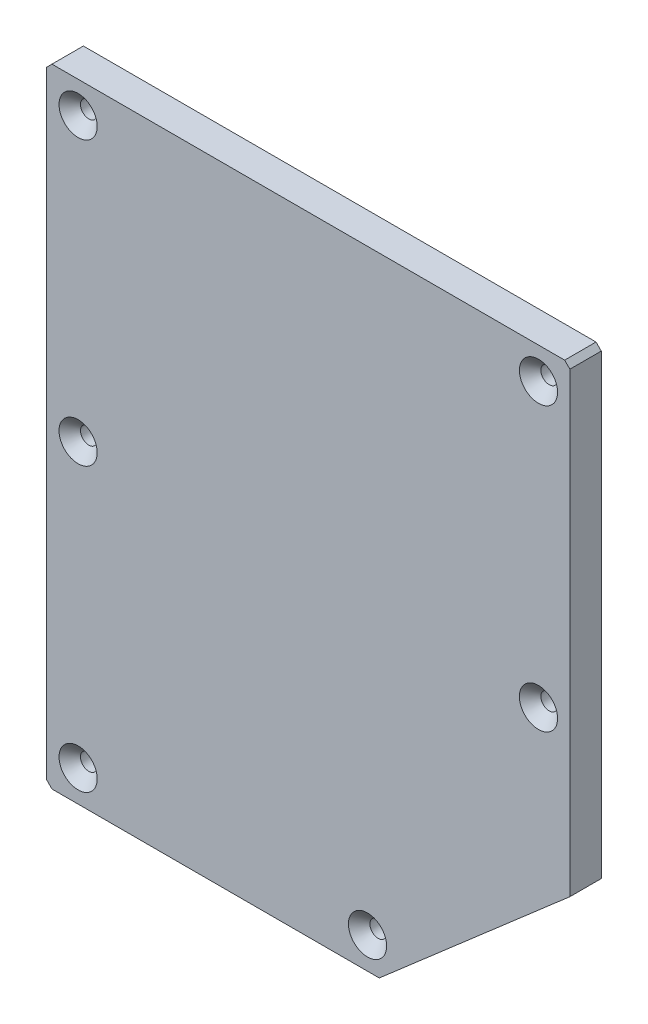
ISO-10303-21;
HEADER;
FILE_DESCRIPTION(('STEP AP214'),'2;1');
FILE_NAME('part.step','',(''),(''),'','','');
FILE_SCHEMA(('AUTOMOTIVE_DESIGN { 1 0 10303 214 1 1 1 1 }'));
ENDSEC;
DATA;
#1=APPLICATION_CONTEXT('core data for automotive mechanical design processes');
#2=APPLICATION_PROTOCOL_DEFINITION('international standard','automotive_design',2000,#1);
#3=PRODUCT_CONTEXT('',#1,'mechanical');
#4=PRODUCT('Part','Part','',(#3));
#5=PRODUCT_RELATED_PRODUCT_CATEGORY('part','',(#4));
#6=PRODUCT_DEFINITION_FORMATION('','',#4);
#7=PRODUCT_DEFINITION_CONTEXT('part definition',#1,'design');
#8=PRODUCT_DEFINITION('design','',#6,#7);
#9=PRODUCT_DEFINITION_SHAPE('','',#8);
#10=(LENGTH_UNIT() NAMED_UNIT(*) SI_UNIT(.MILLI.,.METRE.));
#11=(NAMED_UNIT(*) PLANE_ANGLE_UNIT() SI_UNIT($,.RADIAN.));
#12=(NAMED_UNIT(*) SI_UNIT($,.STERADIAN.) SOLID_ANGLE_UNIT());
#13=UNCERTAINTY_MEASURE_WITH_UNIT(LENGTH_MEASURE(1.E-05),#10,'distance_accuracy_value','');
#14=(GEOMETRIC_REPRESENTATION_CONTEXT(3) GLOBAL_UNCERTAINTY_ASSIGNED_CONTEXT((#13)) GLOBAL_UNIT_ASSIGNED_CONTEXT((#10,
#11,#12)) REPRESENTATION_CONTEXT('',''));
#15=CARTESIAN_POINT('',(0.,0.,0.));
#16=DIRECTION('',(0.,0.,1.));
#17=DIRECTION('',(1.,0.,0.));
#18=AXIS2_PLACEMENT_3D('',#15,#16,#17);
#19=CARTESIAN_POINT('',(23.5648315155221,-76.4003037206351,6.));
#20=DIRECTION('',(-0.656059028990506,0.754709580222773,0.));
#21=DIRECTION('',(-0.754709580222773,-0.656059028990506,0.));
#22=AXIS2_PLACEMENT_3D('',#19,#20,#21);
#23=PLANE('',#22);
#24=DIRECTION('',(0.754709580222773,0.656059028990506,0.));
#25=VECTOR('',#24,1.);
#26=CARTESIAN_POINT('',(23.5648315155221,-76.4003037206351,0.));
#27=LINE('',#26,#25);
#28=CARTESIAN_POINT('',(23.5648315155221,-76.4003037206351,0.));
#29=VERTEX_POINT('',#28);
#30=CARTESIAN_POINT('',(59.999999999999,-44.7276949669797,0.));
#31=VERTEX_POINT('',#30);
#32=EDGE_CURVE('E129',#29,#31,#27,.T.);
#33=ORIENTED_EDGE('',*,*,#32,.T.);
#34=DIRECTION('',(0.,0.,-1.));
#35=VECTOR('',#34,1.);
#36=CARTESIAN_POINT('',(59.999999999999,-44.7276949669797,6.));
#37=LINE('',#36,#35);
#38=CARTESIAN_POINT('',(59.999999999999,-44.7276949669797,6.));
#39=VERTEX_POINT('',#38);
#40=EDGE_CURVE('E11',#39,#31,#37,.T.);
#41=ORIENTED_EDGE('',*,*,#40,.F.);
#42=DIRECTION('',(0.754709580222773,0.656059028990506,0.));
#43=VECTOR('',#42,1.);
#44=CARTESIAN_POINT('',(23.5648315155221,-76.4003037206351,6.));
#45=LINE('',#44,#43);
#46=CARTESIAN_POINT('',(23.5648315155221,-76.4003037206351,6.));
#47=VERTEX_POINT('',#46);
#48=EDGE_CURVE('E144',#47,#39,#45,.T.);
#49=ORIENTED_EDGE('',*,*,#48,.F.);
#50=DIRECTION('',(0.,0.,-1.));
#51=VECTOR('',#50,1.);
#52=CARTESIAN_POINT('',(23.5648315155221,-76.4003037206351,6.));
#53=LINE('',#52,#51);
#54=EDGE_CURVE('E125',#47,#29,#53,.T.);
#55=ORIENTED_EDGE('',*,*,#54,.T.);
#56=EDGE_LOOP('',(#33,#41,#49,#55));
#57=FACE_BOUND('',#56,.T.);
#58=ADVANCED_FACE('F33',(#57),#23,.F.);
#59=CARTESIAN_POINT('',(59.999999999999,-44.7276949669797,6.));
#60=DIRECTION('',(-1.,0.,0.));
#61=DIRECTION('',(0.,-1.,0.));
#62=AXIS2_PLACEMENT_3D('',#59,#60,#61);
#63=PLANE('',#62);
#64=DIRECTION('',(0.,1.,0.));
#65=VECTOR('',#64,1.);
#66=CARTESIAN_POINT('',(59.999999999999,-44.7276949669797,0.));
#67=LINE('',#66,#65);
#68=CARTESIAN_POINT('',(59.9999999999995,42.5996962793654,0.));
#69=VERTEX_POINT('',#68);
#70=EDGE_CURVE('E132',#31,#69,#67,.T.);
#71=ORIENTED_EDGE('',*,*,#70,.T.);
#72=DIRECTION('',(0.,0.,-1.));
#73=VECTOR('',#72,1.);
#74=CARTESIAN_POINT('',(59.9999999999995,42.5996962793654,6.));
#75=LINE('',#74,#73);
#76=CARTESIAN_POINT('',(59.9999999999995,42.5996962793654,6.));
#77=VERTEX_POINT('',#76);
#78=EDGE_CURVE('E41',#77,#69,#75,.T.);
#79=ORIENTED_EDGE('',*,*,#78,.F.);
#80=DIRECTION('',(0.,1.,0.));
#81=VECTOR('',#80,1.);
#82=CARTESIAN_POINT('',(59.999999999999,-44.7276949669797,6.));
#83=LINE('',#82,#81);
#84=EDGE_CURVE('E92',#39,#77,#83,.T.);
#85=ORIENTED_EDGE('',*,*,#84,.F.);
#86=ORIENTED_EDGE('',*,*,#40,.T.);
#87=EDGE_LOOP('',(#71,#79,#85,#86));
#88=FACE_BOUND('',#87,.T.);
#89=ADVANCED_FACE('F264',(#88),#63,.F.);
#90=CARTESIAN_POINT('',(59.9999999999995,42.5996962793654,6.));
#91=DIRECTION('',(-0.707106781186552,-0.707106781186542,0.));
#92=DIRECTION('',(0.707106781186543,-0.707106781186553,0.));
#93=AXIS2_PLACEMENT_3D('',#90,#91,#92);
#94=PLANE('',#93);
#95=DIRECTION('',(-0.707106781186542,0.707106781186552,0.));
#96=VECTOR('',#95,1.);
#97=CARTESIAN_POINT('',(59.9999999999995,42.5996962793654,0.));
#98=LINE('',#97,#96);
#99=CARTESIAN_POINT('',(58.9999999999995,43.5996962793654,0.));
#100=VERTEX_POINT('',#99);
#101=EDGE_CURVE('E135',#69,#100,#98,.T.);
#102=ORIENTED_EDGE('',*,*,#101,.T.);
#103=DIRECTION('',(0.,0.,-1.));
#104=VECTOR('',#103,1.);
#105=CARTESIAN_POINT('',(58.9999999999995,43.5996962793654,6.));
#106=LINE('',#105,#104);
#107=CARTESIAN_POINT('',(58.9999999999995,43.5996962793654,6.));
#108=VERTEX_POINT('',#107);
#109=EDGE_CURVE('E151',#108,#100,#106,.T.);
#110=ORIENTED_EDGE('',*,*,#109,.F.);
#111=DIRECTION('',(-0.707106781186542,0.707106781186552,0.));
#112=VECTOR('',#111,1.);
#113=CARTESIAN_POINT('',(59.9999999999995,42.5996962793654,6.));
#114=LINE('',#113,#112);
#115=EDGE_CURVE('E159',#77,#108,#114,.T.);
#116=ORIENTED_EDGE('',*,*,#115,.F.);
#117=ORIENTED_EDGE('',*,*,#78,.T.);
#118=EDGE_LOOP('',(#102,#110,#116,#117));
#119=FACE_BOUND('',#118,.T.);
#120=ADVANCED_FACE('F157',(#119),#94,.F.);
#121=CARTESIAN_POINT('',(58.9999999999995,43.5996962793654,6.));
#122=DIRECTION('',(0.,-1.,0.));
#123=DIRECTION('',(0.,0.,-1.));
#124=AXIS2_PLACEMENT_3D('',#121,#122,#123);
#125=PLANE('',#124);
#126=DIRECTION('',(-1.,0.,0.));
#127=VECTOR('',#126,1.);
#128=CARTESIAN_POINT('',(58.9999999999995,43.5996962793654,0.));
#129=LINE('',#128,#127);
#130=CARTESIAN_POINT('',(-39.0000000000005,43.5996962793654,0.));
#131=VERTEX_POINT('',#130);
#132=EDGE_CURVE('E137',#100,#131,#129,.T.);
#133=ORIENTED_EDGE('',*,*,#132,.T.);
#134=DIRECTION('',(0.,0.,-1.));
#135=VECTOR('',#134,1.);
#136=CARTESIAN_POINT('',(-39.0000000000005,43.5996962793654,6.));
#137=LINE('',#136,#135);
#138=CARTESIAN_POINT('',(-39.0000000000005,43.5996962793654,6.));
#139=VERTEX_POINT('',#138);
#140=EDGE_CURVE('E148',#139,#131,#137,.T.);
#141=ORIENTED_EDGE('',*,*,#140,.F.);
#142=DIRECTION('',(-1.,0.,0.));
#143=VECTOR('',#142,1.);
#144=CARTESIAN_POINT('',(58.9999999999995,43.5996962793654,6.));
#145=LINE('',#144,#143);
#146=EDGE_CURVE('E171',#108,#139,#145,.T.);
#147=ORIENTED_EDGE('',*,*,#146,.F.);
#148=ORIENTED_EDGE('',*,*,#109,.T.);
#149=EDGE_LOOP('',(#133,#141,#147,#148));
#150=FACE_BOUND('',#149,.T.);
#151=ADVANCED_FACE('F167',(#150),#125,.F.);
#152=CARTESIAN_POINT('',(-39.0000000000005,43.5996962793654,6.));
#153=DIRECTION('',(0.70710678118655,-0.707106781186545,0.));
#154=DIRECTION('',(0.707106781186545,0.70710678118655,0.));
#155=AXIS2_PLACEMENT_3D('',#152,#153,#154);
#156=PLANE('',#155);
#157=DIRECTION('',(-0.707106781186545,-0.70710678118655,0.));
#158=VECTOR('',#157,1.);
#159=CARTESIAN_POINT('',(-39.0000000000005,43.5996962793654,0.));
#160=LINE('',#159,#158);
#161=CARTESIAN_POINT('',(-40.0000000000005,42.5996962793654,0.));
#162=VERTEX_POINT('',#161);
#163=EDGE_CURVE('E139',#131,#162,#160,.T.);
#164=ORIENTED_EDGE('',*,*,#163,.T.);
#165=DIRECTION('',(0.,0.,-1.));
#166=VECTOR('',#165,1.);
#167=CARTESIAN_POINT('',(-40.0000000000005,42.5996962793654,6.));
#168=LINE('',#167,#166);
#169=CARTESIAN_POINT('',(-40.0000000000005,42.5996962793654,6.));
#170=VERTEX_POINT('',#169);
#171=EDGE_CURVE('E120',#170,#162,#168,.T.);
#172=ORIENTED_EDGE('',*,*,#171,.F.);
#173=DIRECTION('',(-0.707106781186545,-0.70710678118655,0.));
#174=VECTOR('',#173,1.);
#175=CARTESIAN_POINT('',(-39.0000000000005,43.5996962793654,6.));
#176=LINE('',#175,#174);
#177=EDGE_CURVE('E111',#139,#170,#176,.T.);
#178=ORIENTED_EDGE('',*,*,#177,.F.);
#179=ORIENTED_EDGE('',*,*,#140,.T.);
#180=EDGE_LOOP('',(#164,#172,#178,#179));
#181=FACE_BOUND('',#180,.T.);
#182=ADVANCED_FACE('F170',(#181),#156,.F.);
#183=CARTESIAN_POINT('',(-40.0000000000005,42.5996962793654,6.));
#184=DIRECTION('',(1.,0.,0.));
#185=DIRECTION('',(0.,1.,0.));
#186=AXIS2_PLACEMENT_3D('',#183,#184,#185);
#187=PLANE('',#186);
#188=DIRECTION('',(0.,-1.,0.));
#189=VECTOR('',#188,1.);
#190=CARTESIAN_POINT('',(-40.0000000000005,42.5996962793654,0.));
#191=LINE('',#190,#189);
#192=CARTESIAN_POINT('',(-40.0000000000005,-75.4003037206346,0.));
#193=VERTEX_POINT('',#192);
#194=EDGE_CURVE('E119',#162,#193,#191,.T.);
#195=ORIENTED_EDGE('',*,*,#194,.T.);
#196=DIRECTION('',(0.,0.,-1.));
#197=VECTOR('',#196,1.);
#198=CARTESIAN_POINT('',(-40.0000000000005,-75.4003037206346,6.));
#199=LINE('',#198,#197);
#200=CARTESIAN_POINT('',(-40.0000000000005,-75.4003037206346,6.));
#201=VERTEX_POINT('',#200);
#202=EDGE_CURVE('E116',#201,#193,#199,.T.);
#203=ORIENTED_EDGE('',*,*,#202,.F.);
#204=DIRECTION('',(0.,-1.,0.));
#205=VECTOR('',#204,1.);
#206=CARTESIAN_POINT('',(-40.0000000000005,42.5996962793654,6.));
#207=LINE('',#206,#205);
#208=EDGE_CURVE('E105',#170,#201,#207,.T.);
#209=ORIENTED_EDGE('',*,*,#208,.F.);
#210=ORIENTED_EDGE('',*,*,#171,.T.);
#211=EDGE_LOOP('',(#195,#203,#209,#210));
#212=FACE_BOUND('',#211,.T.);
#213=ADVANCED_FACE('F117',(#212),#187,.F.);
#214=CARTESIAN_POINT('',(-40.0000000000005,-75.4003037206346,6.));
#215=DIRECTION('',(0.707106781186557,0.707106781186538,0.));
#216=DIRECTION('',(-0.707106781186538,0.707106781186557,0.));
#217=AXIS2_PLACEMENT_3D('',#214,#215,#216);
#218=PLANE('',#217);
#219=DIRECTION('',(0.707106781186538,-0.707106781186557,0.));
#220=VECTOR('',#219,1.);
#221=CARTESIAN_POINT('',(-40.0000000000005,-75.4003037206346,0.));
#222=LINE('',#221,#220);
#223=CARTESIAN_POINT('',(-39.0000000000005,-76.4003037206346,0.));
#224=VERTEX_POINT('',#223);
#225=EDGE_CURVE('E78',#193,#224,#222,.T.);
#226=ORIENTED_EDGE('',*,*,#225,.T.);
#227=DIRECTION('',(0.,0.,-1.));
#228=VECTOR('',#227,1.);
#229=CARTESIAN_POINT('',(-39.0000000000005,-76.4003037206346,6.));
#230=LINE('',#229,#228);
#231=CARTESIAN_POINT('',(-39.0000000000005,-76.4003037206346,6.));
#232=VERTEX_POINT('',#231);
#233=EDGE_CURVE('E121',#232,#224,#230,.T.);
#234=ORIENTED_EDGE('',*,*,#233,.F.);
#235=DIRECTION('',(0.707106781186538,-0.707106781186557,0.));
#236=VECTOR('',#235,1.);
#237=CARTESIAN_POINT('',(-40.0000000000005,-75.4003037206346,6.));
#238=LINE('',#237,#236);
#239=EDGE_CURVE('E109',#201,#232,#238,.T.);
#240=ORIENTED_EDGE('',*,*,#239,.F.);
#241=ORIENTED_EDGE('',*,*,#202,.T.);
#242=EDGE_LOOP('',(#226,#234,#240,#241));
#243=FACE_BOUND('',#242,.T.);
#244=ADVANCED_FACE('F123',(#243),#218,.F.);
#245=CARTESIAN_POINT('',(-39.0000000000005,-76.4003037206346,6.));
#246=DIRECTION('',(0.,1.,0.));
#247=DIRECTION('',(-1.,0.,0.));
#248=AXIS2_PLACEMENT_3D('',#245,#246,#247);
#249=PLANE('',#248);
#250=DIRECTION('',(1.,0.,0.));
#251=VECTOR('',#250,1.);
#252=CARTESIAN_POINT('',(-39.0000000000005,-76.4003037206346,0.));
#253=LINE('',#252,#251);
#254=EDGE_CURVE('E84',#224,#29,#253,.T.);
#255=ORIENTED_EDGE('',*,*,#254,.T.);
#256=ORIENTED_EDGE('',*,*,#54,.F.);
#257=DIRECTION('',(1.,0.,0.));
#258=VECTOR('',#257,1.);
#259=CARTESIAN_POINT('',(-39.0000000000005,-76.4003037206346,6.));
#260=LINE('',#259,#258);
#261=EDGE_CURVE('E49',#232,#47,#260,.T.);
#262=ORIENTED_EDGE('',*,*,#261,.F.);
#263=ORIENTED_EDGE('',*,*,#233,.T.);
#264=EDGE_LOOP('',(#255,#256,#262,#263));
#265=FACE_BOUND('',#264,.T.);
#266=ADVANCED_FACE('F235',(#265),#249,.F.);
#267=CARTESIAN_POINT('',(0.,0.,6.));
#268=DIRECTION('',(0.,0.,1.));
#269=DIRECTION('',(1.,0.,0.));
#270=AXIS2_PLACEMENT_3D('',#267,#268,#269);
#271=PLANE('',#270);
#272=CARTESIAN_POINT('',(-34.000000000001,37.5996962793649,6.));
#273=DIRECTION('',(0.,0.,1.));
#274=DIRECTION('',(1.,0.,0.));
#275=AXIS2_PLACEMENT_3D('',#272,#273,#274);
#276=CIRCLE('',#275,3.65);
#277=CARTESIAN_POINT('',(-30.350000000001,37.5996962793649,6.));
#278=VERTEX_POINT('',#277);
#279=EDGE_CURVE('E227',#278,#278,#276,.T.);
#280=ORIENTED_EDGE('',*,*,#279,.F.);
#281=EDGE_LOOP('',(#280));
#282=FACE_BOUND('',#281,.T.);
#283=CARTESIAN_POINT('',(53.999999999999,37.5996962793649,6.));
#284=DIRECTION('',(0.,0.,1.));
#285=DIRECTION('',(1.,0.,0.));
#286=AXIS2_PLACEMENT_3D('',#283,#284,#285);
#287=CIRCLE('',#286,3.65);
#288=CARTESIAN_POINT('',(57.649999999999,37.5996962793649,6.));
#289=VERTEX_POINT('',#288);
#290=EDGE_CURVE('E218',#289,#289,#287,.T.);
#291=ORIENTED_EDGE('',*,*,#290,.F.);
#292=EDGE_LOOP('',(#291));
#293=FACE_BOUND('',#292,.T.);
#294=CARTESIAN_POINT('',(53.999999999999,-16.4003037206351,6.));
#295=DIRECTION('',(0.,0.,1.));
#296=DIRECTION('',(1.,0.,0.));
#297=AXIS2_PLACEMENT_3D('',#294,#295,#296);
#298=CIRCLE('',#297,3.65);
#299=CARTESIAN_POINT('',(57.649999999999,-16.4003037206351,6.));
#300=VERTEX_POINT('',#299);
#301=EDGE_CURVE('E209',#300,#300,#298,.T.);
#302=ORIENTED_EDGE('',*,*,#301,.F.);
#303=EDGE_LOOP('',(#302));
#304=FACE_BOUND('',#303,.T.);
#305=CARTESIAN_POINT('',(-34.000000000001,-16.4003037206351,6.));
#306=DIRECTION('',(0.,0.,1.));
#307=DIRECTION('',(1.,0.,0.));
#308=AXIS2_PLACEMENT_3D('',#305,#306,#307);
#309=CIRCLE('',#308,3.65);
#310=CARTESIAN_POINT('',(-30.350000000001,-16.4003037206351,6.));
#311=VERTEX_POINT('',#310);
#312=EDGE_CURVE('E200',#311,#311,#309,.T.);
#313=ORIENTED_EDGE('',*,*,#312,.F.);
#314=EDGE_LOOP('',(#313));
#315=FACE_BOUND('',#314,.T.);
#316=CARTESIAN_POINT('',(-34.0000000000005,-70.4003037206346,6.));
#317=DIRECTION('',(0.,0.,1.));
#318=DIRECTION('',(1.,0.,0.));
#319=AXIS2_PLACEMENT_3D('',#316,#317,#318);
#320=CIRCLE('',#319,3.65);
#321=CARTESIAN_POINT('',(-30.3500000000005,-70.4003037206346,6.));
#322=VERTEX_POINT('',#321);
#323=EDGE_CURVE('E191',#322,#322,#320,.T.);
#324=ORIENTED_EDGE('',*,*,#323,.F.);
#325=EDGE_LOOP('',(#324));
#326=FACE_BOUND('',#325,.T.);
#327=CARTESIAN_POINT('',(21.3215234386138,-70.4003037206346,6.));
#328=DIRECTION('',(0.,0.,1.));
#329=DIRECTION('',(1.,0.,0.));
#330=AXIS2_PLACEMENT_3D('',#327,#328,#329);
#331=CIRCLE('',#330,3.65);
#332=CARTESIAN_POINT('',(24.9715234386138,-70.4003037206346,6.));
#333=VERTEX_POINT('',#332);
#334=EDGE_CURVE('E182',#333,#333,#331,.T.);
#335=ORIENTED_EDGE('',*,*,#334,.F.);
#336=EDGE_LOOP('',(#335));
#337=FACE_BOUND('',#336,.T.);
#338=ORIENTED_EDGE('',*,*,#48,.T.);
#339=ORIENTED_EDGE('',*,*,#84,.T.);
#340=ORIENTED_EDGE('',*,*,#115,.T.);
#341=ORIENTED_EDGE('',*,*,#146,.T.);
#342=ORIENTED_EDGE('',*,*,#177,.T.);
#343=ORIENTED_EDGE('',*,*,#208,.T.);
#344=ORIENTED_EDGE('',*,*,#239,.T.);
#345=ORIENTED_EDGE('',*,*,#261,.T.);
#346=EDGE_LOOP('',(#338,#339,#340,#341,#342,#343,#344,#345));
#347=FACE_BOUND('',#346,.T.);
#348=ADVANCED_FACE('F107',(#282,#293,#304,#315,#326,#337,#347),#271,.T.);
#349=CARTESIAN_POINT('',(0.,0.,0.));
#350=DIRECTION('',(0.,0.,1.));
#351=DIRECTION('',(1.,0.,0.));
#352=AXIS2_PLACEMENT_3D('',#349,#350,#351);
#353=PLANE('',#352);
#354=CARTESIAN_POINT('',(-34.000000000001,37.5996962793649,0.));
#355=DIRECTION('',(0.,0.,1.));
#356=DIRECTION('',(1.,0.,0.));
#357=AXIS2_PLACEMENT_3D('',#354,#355,#356);
#358=CIRCLE('',#357,1.6);
#359=CARTESIAN_POINT('',(-32.400000000001,37.5996962793649,0.));
#360=VERTEX_POINT('',#359);
#361=EDGE_CURVE('E221',#360,#360,#358,.T.);
#362=ORIENTED_EDGE('',*,*,#361,.T.);
#363=EDGE_LOOP('',(#362));
#364=FACE_BOUND('',#363,.T.);
#365=CARTESIAN_POINT('',(53.999999999999,37.5996962793649,0.));
#366=DIRECTION('',(0.,0.,1.));
#367=DIRECTION('',(1.,0.,0.));
#368=AXIS2_PLACEMENT_3D('',#365,#366,#367);
#369=CIRCLE('',#368,1.6);
#370=CARTESIAN_POINT('',(55.599999999999,37.5996962793649,0.));
#371=VERTEX_POINT('',#370);
#372=EDGE_CURVE('E212',#371,#371,#369,.T.);
#373=ORIENTED_EDGE('',*,*,#372,.T.);
#374=EDGE_LOOP('',(#373));
#375=FACE_BOUND('',#374,.T.);
#376=CARTESIAN_POINT('',(53.999999999999,-16.4003037206351,0.));
#377=DIRECTION('',(0.,0.,1.));
#378=DIRECTION('',(1.,0.,0.));
#379=AXIS2_PLACEMENT_3D('',#376,#377,#378);
#380=CIRCLE('',#379,1.6);
#381=CARTESIAN_POINT('',(55.599999999999,-16.4003037206351,0.));
#382=VERTEX_POINT('',#381);
#383=EDGE_CURVE('E203',#382,#382,#380,.T.);
#384=ORIENTED_EDGE('',*,*,#383,.T.);
#385=EDGE_LOOP('',(#384));
#386=FACE_BOUND('',#385,.T.);
#387=CARTESIAN_POINT('',(-34.000000000001,-16.4003037206351,0.));
#388=DIRECTION('',(0.,0.,1.));
#389=DIRECTION('',(1.,0.,0.));
#390=AXIS2_PLACEMENT_3D('',#387,#388,#389);
#391=CIRCLE('',#390,1.6);
#392=CARTESIAN_POINT('',(-32.400000000001,-16.4003037206351,0.));
#393=VERTEX_POINT('',#392);
#394=EDGE_CURVE('E194',#393,#393,#391,.T.);
#395=ORIENTED_EDGE('',*,*,#394,.T.);
#396=EDGE_LOOP('',(#395));
#397=FACE_BOUND('',#396,.T.);
#398=CARTESIAN_POINT('',(-34.0000000000005,-70.4003037206346,0.));
#399=DIRECTION('',(0.,0.,1.));
#400=DIRECTION('',(1.,0.,0.));
#401=AXIS2_PLACEMENT_3D('',#398,#399,#400);
#402=CIRCLE('',#401,1.6);
#403=CARTESIAN_POINT('',(-32.4000000000005,-70.4003037206346,0.));
#404=VERTEX_POINT('',#403);
#405=EDGE_CURVE('E185',#404,#404,#402,.T.);
#406=ORIENTED_EDGE('',*,*,#405,.T.);
#407=EDGE_LOOP('',(#406));
#408=FACE_BOUND('',#407,.T.);
#409=CARTESIAN_POINT('',(21.3215234386138,-70.4003037206346,0.));
#410=DIRECTION('',(0.,0.,1.));
#411=DIRECTION('',(1.,0.,0.));
#412=AXIS2_PLACEMENT_3D('',#409,#410,#411);
#413=CIRCLE('',#412,1.6);
#414=CARTESIAN_POINT('',(22.9215234386138,-70.4003037206346,0.));
#415=VERTEX_POINT('',#414);
#416=EDGE_CURVE('E133',#415,#415,#413,.T.);
#417=ORIENTED_EDGE('',*,*,#416,.T.);
#418=EDGE_LOOP('',(#417));
#419=FACE_BOUND('',#418,.T.);
#420=ORIENTED_EDGE('',*,*,#32,.F.);
#421=ORIENTED_EDGE('',*,*,#254,.F.);
#422=ORIENTED_EDGE('',*,*,#225,.F.);
#423=ORIENTED_EDGE('',*,*,#194,.F.);
#424=ORIENTED_EDGE('',*,*,#163,.F.);
#425=ORIENTED_EDGE('',*,*,#132,.F.);
#426=ORIENTED_EDGE('',*,*,#101,.F.);
#427=ORIENTED_EDGE('',*,*,#70,.F.);
#428=EDGE_LOOP('',(#420,#421,#422,#423,#424,#425,#426,#427));
#429=FACE_BOUND('',#428,.T.);
#430=ADVANCED_FACE('F163',(#364,#375,#386,#397,#408,#419,#429),#353,.F.);
#431=CARTESIAN_POINT('',(21.3215234386138,-70.4003037206346,6.));
#432=DIRECTION('',(0.,0.,1.));
#433=DIRECTION('',(1.,0.,0.));
#434=AXIS2_PLACEMENT_3D('',#431,#432,#433);
#435=CYLINDRICAL_SURFACE('',#434,1.6);
#436=ORIENTED_EDGE('',*,*,#416,.F.);
#437=EDGE_LOOP('',(#436));
#438=FACE_BOUND('',#437,.T.);
#439=CARTESIAN_POINT('',(21.3215234386138,-70.4003037206346,3.95));
#440=DIRECTION('',(0.,0.,1.));
#441=DIRECTION('',(1.,0.,0.));
#442=AXIS2_PLACEMENT_3D('',#439,#440,#441);
#443=CIRCLE('',#442,1.6);
#444=CARTESIAN_POINT('',(22.9215234386138,-70.4003037206346,3.95));
#445=VERTEX_POINT('',#444);
#446=EDGE_CURVE('E179',#445,#445,#443,.T.);
#447=ORIENTED_EDGE('',*,*,#446,.T.);
#448=EDGE_LOOP('',(#447));
#449=FACE_BOUND('',#448,.T.);
#450=ADVANCED_FACE('F250',(#438,#449),#435,.F.);
#451=CARTESIAN_POINT('',(21.3215234386138,-70.4003037206346,6.));
#452=DIRECTION('',(0.,0.,1.));
#453=DIRECTION('',(1.,0.,0.));
#454=AXIS2_PLACEMENT_3D('',#451,#452,#453);
#455=CONICAL_SURFACE('',#454,3.65,0.785398163397448);
#456=ORIENTED_EDGE('',*,*,#446,.F.);
#457=EDGE_LOOP('',(#456));
#458=FACE_BOUND('',#457,.T.);
#459=ORIENTED_EDGE('',*,*,#334,.T.);
#460=EDGE_LOOP('',(#459));
#461=FACE_BOUND('',#460,.T.);
#462=ADVANCED_FACE('F247',(#458,#461),#455,.F.);
#463=CARTESIAN_POINT('',(-34.0000000000005,-70.4003037206346,6.));
#464=DIRECTION('',(0.,0.,1.));
#465=DIRECTION('',(1.,0.,0.));
#466=AXIS2_PLACEMENT_3D('',#463,#464,#465);
#467=CYLINDRICAL_SURFACE('',#466,1.6);
#468=ORIENTED_EDGE('',*,*,#405,.F.);
#469=EDGE_LOOP('',(#468));
#470=FACE_BOUND('',#469,.T.);
#471=CARTESIAN_POINT('',(-34.0000000000005,-70.4003037206346,3.95));
#472=DIRECTION('',(0.,0.,1.));
#473=DIRECTION('',(1.,0.,0.));
#474=AXIS2_PLACEMENT_3D('',#471,#472,#473);
#475=CIRCLE('',#474,1.6);
#476=CARTESIAN_POINT('',(-32.4000000000005,-70.4003037206346,3.95));
#477=VERTEX_POINT('',#476);
#478=EDGE_CURVE('E188',#477,#477,#475,.T.);
#479=ORIENTED_EDGE('',*,*,#478,.T.);
#480=EDGE_LOOP('',(#479));
#481=FACE_BOUND('',#480,.T.);
#482=ADVANCED_FACE('F249',(#470,#481),#467,.F.);
#483=CARTESIAN_POINT('',(-34.0000000000005,-70.4003037206346,6.));
#484=DIRECTION('',(0.,0.,1.));
#485=DIRECTION('',(1.,0.,0.));
#486=AXIS2_PLACEMENT_3D('',#483,#484,#485);
#487=CONICAL_SURFACE('',#486,3.65,0.785398163397448);
#488=ORIENTED_EDGE('',*,*,#478,.F.);
#489=EDGE_LOOP('',(#488));
#490=FACE_BOUND('',#489,.T.);
#491=ORIENTED_EDGE('',*,*,#323,.T.);
#492=EDGE_LOOP('',(#491));
#493=FACE_BOUND('',#492,.T.);
#494=ADVANCED_FACE('F257',(#490,#493),#487,.F.);
#495=CARTESIAN_POINT('',(-34.000000000001,-16.4003037206351,6.));
#496=DIRECTION('',(0.,0.,1.));
#497=DIRECTION('',(1.,0.,0.));
#498=AXIS2_PLACEMENT_3D('',#495,#496,#497);
#499=CYLINDRICAL_SURFACE('',#498,1.6);
#500=ORIENTED_EDGE('',*,*,#394,.F.);
#501=EDGE_LOOP('',(#500));
#502=FACE_BOUND('',#501,.T.);
#503=CARTESIAN_POINT('',(-34.000000000001,-16.4003037206351,3.95));
#504=DIRECTION('',(0.,0.,1.));
#505=DIRECTION('',(1.,0.,0.));
#506=AXIS2_PLACEMENT_3D('',#503,#504,#505);
#507=CIRCLE('',#506,1.6);
#508=CARTESIAN_POINT('',(-32.400000000001,-16.4003037206351,3.95));
#509=VERTEX_POINT('',#508);
#510=EDGE_CURVE('E197',#509,#509,#507,.T.);
#511=ORIENTED_EDGE('',*,*,#510,.T.);
#512=EDGE_LOOP('',(#511));
#513=FACE_BOUND('',#512,.T.);
#514=ADVANCED_FACE('F349',(#502,#513),#499,.F.);
#515=CARTESIAN_POINT('',(-34.000000000001,-16.4003037206351,6.));
#516=DIRECTION('',(0.,0.,1.));
#517=DIRECTION('',(1.,0.,0.));
#518=AXIS2_PLACEMENT_3D('',#515,#516,#517);
#519=CONICAL_SURFACE('',#518,3.65,0.785398163397448);
#520=ORIENTED_EDGE('',*,*,#510,.F.);
#521=EDGE_LOOP('',(#520));
#522=FACE_BOUND('',#521,.T.);
#523=ORIENTED_EDGE('',*,*,#312,.T.);
#524=EDGE_LOOP('',(#523));
#525=FACE_BOUND('',#524,.T.);
#526=ADVANCED_FACE('F359',(#522,#525),#519,.F.);
#527=CARTESIAN_POINT('',(53.999999999999,-16.4003037206351,6.));
#528=DIRECTION('',(0.,0.,1.));
#529=DIRECTION('',(1.,0.,0.));
#530=AXIS2_PLACEMENT_3D('',#527,#528,#529);
#531=CYLINDRICAL_SURFACE('',#530,1.6);
#532=ORIENTED_EDGE('',*,*,#383,.F.);
#533=EDGE_LOOP('',(#532));
#534=FACE_BOUND('',#533,.T.);
#535=CARTESIAN_POINT('',(53.999999999999,-16.4003037206351,3.95));
#536=DIRECTION('',(0.,0.,1.));
#537=DIRECTION('',(1.,0.,0.));
#538=AXIS2_PLACEMENT_3D('',#535,#536,#537);
#539=CIRCLE('',#538,1.6);
#540=CARTESIAN_POINT('',(55.599999999999,-16.4003037206351,3.95));
#541=VERTEX_POINT('',#540);
#542=EDGE_CURVE('E206',#541,#541,#539,.T.);
#543=ORIENTED_EDGE('',*,*,#542,.T.);
#544=EDGE_LOOP('',(#543));
#545=FACE_BOUND('',#544,.T.);
#546=ADVANCED_FACE('F369',(#534,#545),#531,.F.);
#547=CARTESIAN_POINT('',(53.999999999999,-16.4003037206351,6.));
#548=DIRECTION('',(0.,0.,1.));
#549=DIRECTION('',(1.,0.,0.));
#550=AXIS2_PLACEMENT_3D('',#547,#548,#549);
#551=CONICAL_SURFACE('',#550,3.65,0.785398163397448);
#552=ORIENTED_EDGE('',*,*,#542,.F.);
#553=EDGE_LOOP('',(#552));
#554=FACE_BOUND('',#553,.T.);
#555=ORIENTED_EDGE('',*,*,#301,.T.);
#556=EDGE_LOOP('',(#555));
#557=FACE_BOUND('',#556,.T.);
#558=ADVANCED_FACE('F379',(#554,#557),#551,.F.);
#559=CARTESIAN_POINT('',(53.999999999999,37.5996962793649,6.));
#560=DIRECTION('',(0.,0.,1.));
#561=DIRECTION('',(1.,0.,0.));
#562=AXIS2_PLACEMENT_3D('',#559,#560,#561);
#563=CYLINDRICAL_SURFACE('',#562,1.6);
#564=ORIENTED_EDGE('',*,*,#372,.F.);
#565=EDGE_LOOP('',(#564));
#566=FACE_BOUND('',#565,.T.);
#567=CARTESIAN_POINT('',(53.999999999999,37.5996962793649,3.95));
#568=DIRECTION('',(0.,0.,1.));
#569=DIRECTION('',(1.,0.,0.));
#570=AXIS2_PLACEMENT_3D('',#567,#568,#569);
#571=CIRCLE('',#570,1.6);
#572=CARTESIAN_POINT('',(55.599999999999,37.5996962793649,3.95));
#573=VERTEX_POINT('',#572);
#574=EDGE_CURVE('E215',#573,#573,#571,.T.);
#575=ORIENTED_EDGE('',*,*,#574,.T.);
#576=EDGE_LOOP('',(#575));
#577=FACE_BOUND('',#576,.T.);
#578=ADVANCED_FACE('F389',(#566,#577),#563,.F.);
#579=CARTESIAN_POINT('',(53.999999999999,37.5996962793649,6.));
#580=DIRECTION('',(0.,0.,1.));
#581=DIRECTION('',(1.,0.,0.));
#582=AXIS2_PLACEMENT_3D('',#579,#580,#581);
#583=CONICAL_SURFACE('',#582,3.65,0.785398163397448);
#584=ORIENTED_EDGE('',*,*,#574,.F.);
#585=EDGE_LOOP('',(#584));
#586=FACE_BOUND('',#585,.T.);
#587=ORIENTED_EDGE('',*,*,#290,.T.);
#588=EDGE_LOOP('',(#587));
#589=FACE_BOUND('',#588,.T.);
#590=ADVANCED_FACE('F399',(#586,#589),#583,.F.);
#591=CARTESIAN_POINT('',(-34.000000000001,37.5996962793649,6.));
#592=DIRECTION('',(0.,0.,1.));
#593=DIRECTION('',(1.,0.,0.));
#594=AXIS2_PLACEMENT_3D('',#591,#592,#593);
#595=CYLINDRICAL_SURFACE('',#594,1.6);
#596=ORIENTED_EDGE('',*,*,#361,.F.);
#597=EDGE_LOOP('',(#596));
#598=FACE_BOUND('',#597,.T.);
#599=CARTESIAN_POINT('',(-34.000000000001,37.5996962793649,3.95));
#600=DIRECTION('',(0.,0.,1.));
#601=DIRECTION('',(1.,0.,0.));
#602=AXIS2_PLACEMENT_3D('',#599,#600,#601);
#603=CIRCLE('',#602,1.6);
#604=CARTESIAN_POINT('',(-32.400000000001,37.5996962793649,3.95));
#605=VERTEX_POINT('',#604);
#606=EDGE_CURVE('E224',#605,#605,#603,.T.);
#607=ORIENTED_EDGE('',*,*,#606,.T.);
#608=EDGE_LOOP('',(#607));
#609=FACE_BOUND('',#608,.T.);
#610=ADVANCED_FACE('F409',(#598,#609),#595,.F.);
#611=CARTESIAN_POINT('',(-34.000000000001,37.5996962793649,6.));
#612=DIRECTION('',(0.,0.,1.));
#613=DIRECTION('',(1.,0.,0.));
#614=AXIS2_PLACEMENT_3D('',#611,#612,#613);
#615=CONICAL_SURFACE('',#614,3.65,0.785398163397448);
#616=ORIENTED_EDGE('',*,*,#606,.F.);
#617=EDGE_LOOP('',(#616));
#618=FACE_BOUND('',#617,.T.);
#619=ORIENTED_EDGE('',*,*,#279,.T.);
#620=EDGE_LOOP('',(#619));
#621=FACE_BOUND('',#620,.T.);
#622=ADVANCED_FACE('F231',(#618,#621),#615,.F.);
#623=CLOSED_SHELL('',(#58,#89,#120,#151,#182,#213,#244,#266,#348,#430,#450,#462,#482,#494,#514,
#526,#546,#558,#578,#590,#610,#622));
#624=MANIFOLD_SOLID_BREP('B2',#623);
#625=ADVANCED_BREP_SHAPE_REPRESENTATION('',(#18,#624),#14);
#626=SHAPE_DEFINITION_REPRESENTATION(#9,#625);
ENDSEC;
END-ISO-10303-21;
